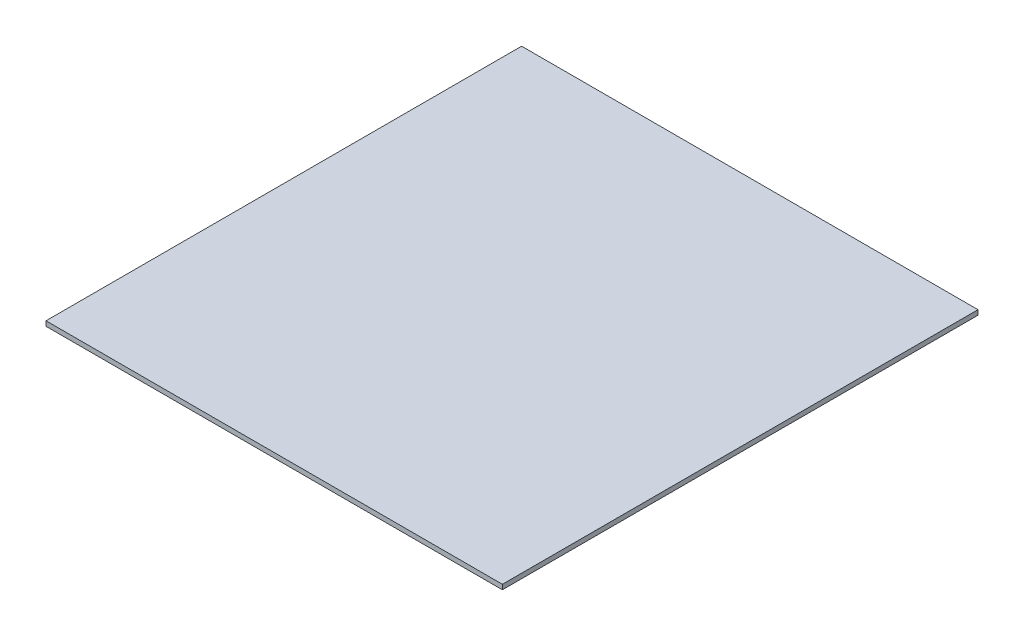
ISO-10303-21;
HEADER;
FILE_DESCRIPTION(('STEP AP214'),'2;1');
FILE_NAME('part.step','',(''),(''),'','','');
FILE_SCHEMA(('AUTOMOTIVE_DESIGN { 1 0 10303 214 1 1 1 1 }'));
ENDSEC;
DATA;
#1=APPLICATION_CONTEXT('core data for automotive mechanical design processes');
#2=APPLICATION_PROTOCOL_DEFINITION('international standard','automotive_design',2000,#1);
#3=PRODUCT_CONTEXT('',#1,'mechanical');
#4=PRODUCT('Part','Part','',(#3));
#5=PRODUCT_RELATED_PRODUCT_CATEGORY('part','',(#4));
#6=PRODUCT_DEFINITION_FORMATION('','',#4);
#7=PRODUCT_DEFINITION_CONTEXT('part definition',#1,'design');
#8=PRODUCT_DEFINITION('design','',#6,#7);
#9=PRODUCT_DEFINITION_SHAPE('','',#8);
#10=(LENGTH_UNIT() NAMED_UNIT(*) SI_UNIT(.MILLI.,.METRE.));
#11=(NAMED_UNIT(*) PLANE_ANGLE_UNIT() SI_UNIT($,.RADIAN.));
#12=(NAMED_UNIT(*) SI_UNIT($,.STERADIAN.) SOLID_ANGLE_UNIT());
#13=UNCERTAINTY_MEASURE_WITH_UNIT(LENGTH_MEASURE(1.E-05),#10,'distance_accuracy_value','');
#14=(GEOMETRIC_REPRESENTATION_CONTEXT(3) GLOBAL_UNCERTAINTY_ASSIGNED_CONTEXT((#13)) GLOBAL_UNIT_ASSIGNED_CONTEXT((#10,
#11,#12)) REPRESENTATION_CONTEXT('',''));
#15=CARTESIAN_POINT('',(0.,0.,0.));
#16=DIRECTION('',(0.,0.,1.));
#17=DIRECTION('',(1.,0.,0.));
#18=AXIS2_PLACEMENT_3D('',#15,#16,#17);
#19=CARTESIAN_POINT('',(95.,1.,99.));
#20=DIRECTION('',(-1.,0.,0.));
#21=DIRECTION('',(0.,0.,1.));
#22=AXIS2_PLACEMENT_3D('',#19,#20,#21);
#23=PLANE('',#22);
#24=DIRECTION('',(0.,0.,-1.));
#25=VECTOR('',#24,1.);
#26=CARTESIAN_POINT('',(95.,-1.,99.));
#27=LINE('',#26,#25);
#28=CARTESIAN_POINT('',(95.,-1.,99.));
#29=VERTEX_POINT('',#28);
#30=CARTESIAN_POINT('',(95.,-1.,-99.));
#31=VERTEX_POINT('',#30);
#32=EDGE_CURVE('E96',#29,#31,#27,.T.);
#33=ORIENTED_EDGE('',*,*,#32,.T.);
#34=DIRECTION('',(0.,-1.,0.));
#35=VECTOR('',#34,1.);
#36=CARTESIAN_POINT('',(95.,1.,-99.));
#37=LINE('',#36,#35);
#38=CARTESIAN_POINT('',(95.,1.,-99.));
#39=VERTEX_POINT('',#38);
#40=EDGE_CURVE('E11',#39,#31,#37,.T.);
#41=ORIENTED_EDGE('',*,*,#40,.F.);
#42=DIRECTION('',(0.,0.,-1.));
#43=VECTOR('',#42,1.);
#44=CARTESIAN_POINT('',(95.,1.,99.));
#45=LINE('',#44,#43);
#46=CARTESIAN_POINT('',(95.,1.,99.));
#47=VERTEX_POINT('',#46);
#48=EDGE_CURVE('E84',#47,#39,#45,.T.);
#49=ORIENTED_EDGE('',*,*,#48,.F.);
#50=DIRECTION('',(0.,-1.,0.));
#51=VECTOR('',#50,1.);
#52=CARTESIAN_POINT('',(95.,1.,99.));
#53=LINE('',#52,#51);
#54=EDGE_CURVE('E92',#47,#29,#53,.T.);
#55=ORIENTED_EDGE('',*,*,#54,.T.);
#56=EDGE_LOOP('',(#33,#41,#49,#55));
#57=FACE_BOUND('',#56,.T.);
#58=ADVANCED_FACE('F33',(#57),#23,.F.);
#59=CARTESIAN_POINT('',(-95.,1.,-99.));
#60=DIRECTION('',(0.,0.,1.));
#61=DIRECTION('',(1.,0.,0.));
#62=AXIS2_PLACEMENT_3D('',#59,#60,#61);
#63=PLANE('',#62);
#64=DIRECTION('',(-1.,0.,0.));
#65=VECTOR('',#64,1.);
#66=CARTESIAN_POINT('',(-95.,-1.,-99.));
#67=LINE('',#66,#65);
#68=CARTESIAN_POINT('',(-95.,-1.,-99.));
#69=VERTEX_POINT('',#68);
#70=EDGE_CURVE('E88',#31,#69,#67,.T.);
#71=ORIENTED_EDGE('',*,*,#70,.T.);
#72=DIRECTION('',(0.,-1.,0.));
#73=VECTOR('',#72,1.);
#74=CARTESIAN_POINT('',(-95.,1.,-99.));
#75=LINE('',#74,#73);
#76=CARTESIAN_POINT('',(-95.,1.,-99.));
#77=VERTEX_POINT('',#76);
#78=EDGE_CURVE('E41',#77,#69,#75,.T.);
#79=ORIENTED_EDGE('',*,*,#78,.F.);
#80=DIRECTION('',(-1.,0.,0.));
#81=VECTOR('',#80,1.);
#82=CARTESIAN_POINT('',(-95.,1.,-99.));
#83=LINE('',#82,#81);
#84=EDGE_CURVE('E79',#39,#77,#83,.T.);
#85=ORIENTED_EDGE('',*,*,#84,.F.);
#86=ORIENTED_EDGE('',*,*,#40,.T.);
#87=EDGE_LOOP('',(#71,#79,#85,#86));
#88=FACE_BOUND('',#87,.T.);
#89=ADVANCED_FACE('F87',(#88),#63,.F.);
#90=CARTESIAN_POINT('',(-95.,1.,99.));
#91=DIRECTION('',(1.,0.,0.));
#92=DIRECTION('',(0.,0.,-1.));
#93=AXIS2_PLACEMENT_3D('',#90,#91,#92);
#94=PLANE('',#93);
#95=DIRECTION('',(0.,0.,1.));
#96=VECTOR('',#95,1.);
#97=CARTESIAN_POINT('',(-95.,-1.,99.));
#98=LINE('',#97,#96);
#99=CARTESIAN_POINT('',(-95.,-1.,99.));
#100=VERTEX_POINT('',#99);
#101=EDGE_CURVE('E66',#69,#100,#98,.T.);
#102=ORIENTED_EDGE('',*,*,#101,.T.);
#103=DIRECTION('',(0.,-1.,0.));
#104=VECTOR('',#103,1.);
#105=CARTESIAN_POINT('',(-95.,1.,99.));
#106=LINE('',#105,#104);
#107=CARTESIAN_POINT('',(-95.,1.,99.));
#108=VERTEX_POINT('',#107);
#109=EDGE_CURVE('E89',#108,#100,#106,.T.);
#110=ORIENTED_EDGE('',*,*,#109,.F.);
#111=DIRECTION('',(0.,0.,1.));
#112=VECTOR('',#111,1.);
#113=CARTESIAN_POINT('',(-95.,1.,99.));
#114=LINE('',#113,#112);
#115=EDGE_CURVE('E82',#77,#108,#114,.T.);
#116=ORIENTED_EDGE('',*,*,#115,.F.);
#117=ORIENTED_EDGE('',*,*,#78,.T.);
#118=EDGE_LOOP('',(#102,#110,#116,#117));
#119=FACE_BOUND('',#118,.T.);
#120=ADVANCED_FACE('F90',(#119),#94,.F.);
#121=CARTESIAN_POINT('',(-95.,1.,99.));
#122=DIRECTION('',(0.,0.,-1.));
#123=DIRECTION('',(-1.,0.,0.));
#124=AXIS2_PLACEMENT_3D('',#121,#122,#123);
#125=PLANE('',#124);
#126=DIRECTION('',(1.,0.,0.));
#127=VECTOR('',#126,1.);
#128=CARTESIAN_POINT('',(-95.,-1.,99.));
#129=LINE('',#128,#127);
#130=EDGE_CURVE('E72',#100,#29,#129,.T.);
#131=ORIENTED_EDGE('',*,*,#130,.T.);
#132=ORIENTED_EDGE('',*,*,#54,.F.);
#133=DIRECTION('',(1.,0.,0.));
#134=VECTOR('',#133,1.);
#135=CARTESIAN_POINT('',(-95.,1.,99.));
#136=LINE('',#135,#134);
#137=EDGE_CURVE('E49',#108,#47,#136,.T.);
#138=ORIENTED_EDGE('',*,*,#137,.F.);
#139=ORIENTED_EDGE('',*,*,#109,.T.);
#140=EDGE_LOOP('',(#131,#132,#138,#139));
#141=FACE_BOUND('',#140,.T.);
#142=ADVANCED_FACE('F103',(#141),#125,.F.);
#143=CARTESIAN_POINT('',(0.,1.,0.));
#144=DIRECTION('',(0.,-1.,0.));
#145=DIRECTION('',(0.,0.,-1.));
#146=AXIS2_PLACEMENT_3D('',#143,#144,#145);
#147=PLANE('',#146);
#148=ORIENTED_EDGE('',*,*,#48,.T.);
#149=ORIENTED_EDGE('',*,*,#84,.T.);
#150=ORIENTED_EDGE('',*,*,#115,.T.);
#151=ORIENTED_EDGE('',*,*,#137,.T.);
#152=EDGE_LOOP('',(#148,#149,#150,#151));
#153=FACE_BOUND('',#152,.T.);
#154=ADVANCED_FACE('F80',(#153),#147,.F.);
#155=CARTESIAN_POINT('',(0.,-1.,0.));
#156=DIRECTION('',(0.,-1.,0.));
#157=DIRECTION('',(0.,0.,-1.));
#158=AXIS2_PLACEMENT_3D('',#155,#156,#157);
#159=PLANE('',#158);
#160=ORIENTED_EDGE('',*,*,#32,.F.);
#161=ORIENTED_EDGE('',*,*,#130,.F.);
#162=ORIENTED_EDGE('',*,*,#101,.F.);
#163=ORIENTED_EDGE('',*,*,#70,.F.);
#164=EDGE_LOOP('',(#160,#161,#162,#163));
#165=FACE_BOUND('',#164,.T.);
#166=ADVANCED_FACE('F106',(#165),#159,.T.);
#167=CLOSED_SHELL('',(#58,#89,#120,#142,#154,#166));
#168=MANIFOLD_SOLID_BREP('B2',#167);
#169=ADVANCED_BREP_SHAPE_REPRESENTATION('',(#18,#168),#14);
#170=SHAPE_DEFINITION_REPRESENTATION(#9,#169);
ENDSEC;
END-ISO-10303-21;
